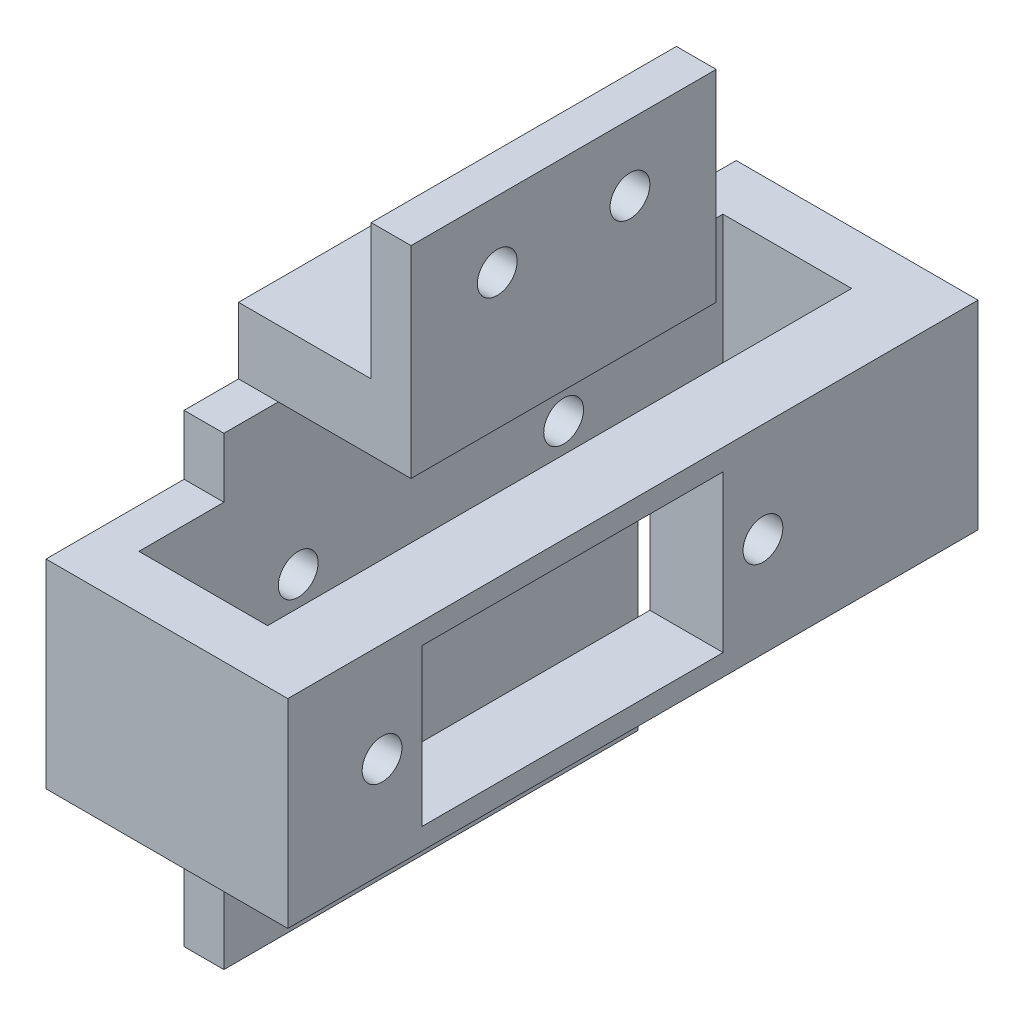
ISO-10303-21;
HEADER;
FILE_DESCRIPTION(('STEP AP214'),'2;1');
FILE_NAME('part.step','',(''),(''),'','','');
FILE_SCHEMA(('AUTOMOTIVE_DESIGN { 1 0 10303 214 1 1 1 1 }'));
ENDSEC;
DATA;
#1=APPLICATION_CONTEXT('core data for automotive mechanical design processes');
#2=APPLICATION_PROTOCOL_DEFINITION('international standard','automotive_design',2000,#1);
#3=PRODUCT_CONTEXT('',#1,'mechanical');
#4=PRODUCT('Part','Part','',(#3));
#5=PRODUCT_RELATED_PRODUCT_CATEGORY('part','',(#4));
#6=PRODUCT_DEFINITION_FORMATION('','',#4);
#7=PRODUCT_DEFINITION_CONTEXT('part definition',#1,'design');
#8=PRODUCT_DEFINITION('design','',#6,#7);
#9=PRODUCT_DEFINITION_SHAPE('','',#8);
#10=(LENGTH_UNIT() NAMED_UNIT(*) SI_UNIT(.MILLI.,.METRE.));
#11=(NAMED_UNIT(*) PLANE_ANGLE_UNIT() SI_UNIT($,.RADIAN.));
#12=(NAMED_UNIT(*) SI_UNIT($,.STERADIAN.) SOLID_ANGLE_UNIT());
#13=UNCERTAINTY_MEASURE_WITH_UNIT(LENGTH_MEASURE(1.E-05),#10,'distance_accuracy_value','');
#14=(GEOMETRIC_REPRESENTATION_CONTEXT(3) GLOBAL_UNCERTAINTY_ASSIGNED_CONTEXT((#13)) GLOBAL_UNIT_ASSIGNED_CONTEXT((#10,
#11,#12)) REPRESENTATION_CONTEXT('',''));
#15=CARTESIAN_POINT('',(0.,0.,0.));
#16=DIRECTION('',(0.,0.,1.));
#17=DIRECTION('',(1.,0.,0.));
#18=AXIS2_PLACEMENT_3D('',#15,#16,#17);
#19=CARTESIAN_POINT('',(2.69999999999999,0.,0.));
#20=DIRECTION('',(1.,0.,0.));
#21=DIRECTION('',(0.,0.,-1.));
#22=AXIS2_PLACEMENT_3D('',#19,#20,#21);
#23=PLANE('',#22);
#24=CARTESIAN_POINT('',(2.69999999999999,-27.2,7.4));
#25=DIRECTION('',(1.,0.,0.));
#26=DIRECTION('',(0.,0.,-1.));
#27=AXIS2_PLACEMENT_3D('',#24,#25,#26);
#28=CIRCLE('',#27,1.5);
#29=CARTESIAN_POINT('',(2.69999999999999,-27.2,5.9));
#30=VERTEX_POINT('',#29);
#31=EDGE_CURVE('E251',#30,#30,#28,.T.);
#32=ORIENTED_EDGE('',*,*,#31,.T.);
#33=EDGE_LOOP('',(#32));
#34=FACE_BOUND('',#33,.T.);
#35=DIRECTION('',(0.,0.,-1.));
#36=VECTOR('',#35,1.);
#37=CARTESIAN_POINT('',(2.69999999999999,-34.7,14.5058237934551));
#38=LINE('',#37,#36);
#39=CARTESIAN_POINT('',(2.69999999999999,-34.7,10.5058237934551));
#40=VERTEX_POINT('',#39);
#41=CARTESIAN_POINT('',(2.7,-34.7,-33.5058237934551));
#42=VERTEX_POINT('',#41);
#43=EDGE_CURVE('E303',#40,#42,#38,.T.);
#44=ORIENTED_EDGE('',*,*,#43,.F.);
#45=DIRECTION('',(0.,1.,0.));
#46=VECTOR('',#45,1.);
#47=CARTESIAN_POINT('',(2.69999999999999,-19.7,10.5058237934551));
#48=LINE('',#47,#46);
#49=CARTESIAN_POINT('',(2.69999999999999,-19.7,10.5058237934551));
#50=VERTEX_POINT('',#49);
#51=EDGE_CURVE('E317',#40,#50,#48,.T.);
#52=ORIENTED_EDGE('',*,*,#51,.T.);
#53=DIRECTION('',(0.,0.,1.));
#54=VECTOR('',#53,1.);
#55=CARTESIAN_POINT('',(2.69999999999999,-19.7,14.5058237934551));
#56=LINE('',#55,#54);
#57=CARTESIAN_POINT('',(2.7,-19.7,-33.5058237934551));
#58=VERTEX_POINT('',#57);
#59=EDGE_CURVE('E308',#58,#50,#56,.T.);
#60=ORIENTED_EDGE('',*,*,#59,.F.);
#61=DIRECTION('',(0.,1.,0.));
#62=VECTOR('',#61,1.);
#63=CARTESIAN_POINT('',(2.7,-19.7,-33.5058237934551));
#64=LINE('',#63,#62);
#65=EDGE_CURVE('E264',#42,#58,#64,.T.);
#66=ORIENTED_EDGE('',*,*,#65,.F.);
#67=EDGE_LOOP('',(#44,#52,#60,#66));
#68=FACE_BOUND('',#67,.T.);
#69=DIRECTION('',(0.,-1.,0.));
#70=VECTOR('',#69,1.);
#71=CARTESIAN_POINT('',(2.69999999999999,0.,-18.3));
#72=LINE('',#71,#70);
#73=CARTESIAN_POINT('',(2.69999999999999,-21.3,-18.3));
#74=VERTEX_POINT('',#73);
#75=CARTESIAN_POINT('',(2.69999999999999,-33.1,-18.3));
#76=VERTEX_POINT('',#75);
#77=EDGE_CURVE('E229',#74,#76,#72,.T.);
#78=ORIENTED_EDGE('',*,*,#77,.F.);
#79=DIRECTION('',(0.,0.,-1.));
#80=VECTOR('',#79,1.);
#81=CARTESIAN_POINT('',(2.69999999999999,-21.3,0.));
#82=LINE('',#81,#80);
#83=CARTESIAN_POINT('',(2.69999999999999,-21.3,4.4));
#84=VERTEX_POINT('',#83);
#85=EDGE_CURVE('E221',#84,#74,#82,.T.);
#86=ORIENTED_EDGE('',*,*,#85,.F.);
#87=DIRECTION('',(0.,-1.,0.));
#88=VECTOR('',#87,1.);
#89=CARTESIAN_POINT('',(2.69999999999999,0.,4.40000000000001));
#90=LINE('',#89,#88);
#91=CARTESIAN_POINT('',(2.69999999999999,-33.1,4.4));
#92=VERTEX_POINT('',#91);
#93=EDGE_CURVE('E57',#84,#92,#90,.T.);
#94=ORIENTED_EDGE('',*,*,#93,.T.);
#95=DIRECTION('',(0.,0.,-1.));
#96=VECTOR('',#95,1.);
#97=CARTESIAN_POINT('',(2.69999999999999,-33.1,0.));
#98=LINE('',#97,#96);
#99=EDGE_CURVE('E233',#92,#76,#98,.T.);
#100=ORIENTED_EDGE('',*,*,#99,.T.);
#101=EDGE_LOOP('',(#78,#86,#94,#100));
#102=FACE_BOUND('',#101,.T.);
#103=CARTESIAN_POINT('',(2.7,-27.2,-21.3));
#104=DIRECTION('',(1.,0.,0.));
#105=DIRECTION('',(0.,0.,-1.));
#106=AXIS2_PLACEMENT_3D('',#103,#104,#105);
#107=CIRCLE('',#106,1.5);
#108=CARTESIAN_POINT('',(2.7,-27.2,-22.8));
#109=VERTEX_POINT('',#108);
#110=EDGE_CURVE('E453',#109,#109,#107,.F.);
#111=ORIENTED_EDGE('',*,*,#110,.F.);
#112=EDGE_LOOP('',(#111));
#113=FACE_BOUND('',#112,.T.);
#114=ADVANCED_FACE('F38',(#34,#68,#102,#113),#23,.F.);
#115=CARTESIAN_POINT('',(8.21999999999999,0.,0.));
#116=DIRECTION('',(1.,0.,0.));
#117=DIRECTION('',(0.,0.,-1.));
#118=AXIS2_PLACEMENT_3D('',#115,#116,#117);
#119=PLANE('',#118);
#120=DIRECTION('',(0.,0.,-1.));
#121=VECTOR('',#120,1.);
#122=CARTESIAN_POINT('',(8.21999999999999,-21.3,0.));
#123=LINE('',#122,#121);
#124=CARTESIAN_POINT('',(8.21999999999999,-21.3,4.4));
#125=VERTEX_POINT('',#124);
#126=CARTESIAN_POINT('',(8.22,-21.3,-18.3));
#127=VERTEX_POINT('',#126);
#128=EDGE_CURVE('E250',#125,#127,#123,.T.);
#129=ORIENTED_EDGE('',*,*,#128,.T.);
#130=DIRECTION('',(0.,-1.,0.));
#131=VECTOR('',#130,1.);
#132=CARTESIAN_POINT('',(8.22,0.,-18.3));
#133=LINE('',#132,#131);
#134=CARTESIAN_POINT('',(8.22,-33.1,-18.3));
#135=VERTEX_POINT('',#134);
#136=EDGE_CURVE('E65',#127,#135,#133,.T.);
#137=ORIENTED_EDGE('',*,*,#136,.T.);
#138=DIRECTION('',(0.,0.,-1.));
#139=VECTOR('',#138,1.);
#140=CARTESIAN_POINT('',(8.21999999999999,-33.1,0.));
#141=LINE('',#140,#139);
#142=CARTESIAN_POINT('',(8.21999999999999,-33.1,4.4));
#143=VERTEX_POINT('',#142);
#144=EDGE_CURVE('E238',#143,#135,#141,.T.);
#145=ORIENTED_EDGE('',*,*,#144,.F.);
#146=DIRECTION('',(0.,-1.,0.));
#147=VECTOR('',#146,1.);
#148=CARTESIAN_POINT('',(8.21999999999999,0.,4.40000000000001));
#149=LINE('',#148,#147);
#150=EDGE_CURVE('E241',#125,#143,#149,.T.);
#151=ORIENTED_EDGE('',*,*,#150,.F.);
#152=EDGE_LOOP('',(#129,#137,#145,#151));
#153=FACE_BOUND('',#152,.T.);
#154=DIRECTION('',(0.,-1.,0.));
#155=VECTOR('',#154,1.);
#156=CARTESIAN_POINT('',(8.21999999999999,-19.7,14.5058237934551));
#157=LINE('',#156,#155);
#158=CARTESIAN_POINT('',(8.21999999999999,-19.7,14.5058237934551));
#159=VERTEX_POINT('',#158);
#160=CARTESIAN_POINT('',(8.21999999999999,-34.7,14.5058237934551));
#161=VERTEX_POINT('',#160);
#162=EDGE_CURVE('E304',#159,#161,#157,.T.);
#163=ORIENTED_EDGE('',*,*,#162,.T.);
#164=DIRECTION('',(0.,0.,-1.));
#165=VECTOR('',#164,1.);
#166=CARTESIAN_POINT('',(8.21999999999999,-34.7,14.5058237934551));
#167=LINE('',#166,#165);
#168=CARTESIAN_POINT('',(8.22,-34.7,-37.5058237934551));
#169=VERTEX_POINT('',#168);
#170=EDGE_CURVE('E307',#161,#169,#167,.T.);
#171=ORIENTED_EDGE('',*,*,#170,.T.);
#172=DIRECTION('',(0.,-1.,0.));
#173=VECTOR('',#172,1.);
#174=CARTESIAN_POINT('',(8.22,-19.7,-37.5058237934551));
#175=LINE('',#174,#173);
#176=CARTESIAN_POINT('',(8.22,-19.7,-37.5058237934551));
#177=VERTEX_POINT('',#176);
#178=EDGE_CURVE('E257',#177,#169,#175,.T.);
#179=ORIENTED_EDGE('',*,*,#178,.F.);
#180=DIRECTION('',(0.,0.,1.));
#181=VECTOR('',#180,1.);
#182=CARTESIAN_POINT('',(8.21999999999999,-19.7,14.5058237934551));
#183=LINE('',#182,#181);
#184=EDGE_CURVE('E310',#177,#159,#183,.T.);
#185=ORIENTED_EDGE('',*,*,#184,.T.);
#186=EDGE_LOOP('',(#163,#171,#179,#185));
#187=FACE_BOUND('',#186,.T.);
#188=CARTESIAN_POINT('',(8.21999999999999,-27.2,7.4));
#189=DIRECTION('',(1.,0.,0.));
#190=DIRECTION('',(0.,0.,-1.));
#191=AXIS2_PLACEMENT_3D('',#188,#189,#190);
#192=CIRCLE('',#191,1.5);
#193=CARTESIAN_POINT('',(8.21999999999999,-27.2,5.9));
#194=VERTEX_POINT('',#193);
#195=EDGE_CURVE('E457',#194,#194,#192,.T.);
#196=ORIENTED_EDGE('',*,*,#195,.F.);
#197=EDGE_LOOP('',(#196));
#198=FACE_BOUND('',#197,.T.);
#199=CARTESIAN_POINT('',(8.22,-27.2,-21.3));
#200=DIRECTION('',(1.,0.,0.));
#201=DIRECTION('',(0.,0.,-1.));
#202=AXIS2_PLACEMENT_3D('',#199,#200,#201);
#203=CIRCLE('',#202,1.5);
#204=CARTESIAN_POINT('',(8.22,-27.2,-22.8));
#205=VERTEX_POINT('',#204);
#206=EDGE_CURVE('E244',#205,#205,#203,.F.);
#207=ORIENTED_EDGE('',*,*,#206,.T.);
#208=EDGE_LOOP('',(#207));
#209=FACE_BOUND('',#208,.T.);
#210=ADVANCED_FACE('F557',(#153,#187,#198,#209),#119,.T.);
#211=CARTESIAN_POINT('',(-9.99999999999999,-50.2,-27.1));
#212=DIRECTION('',(0.,0.,1.));
#213=DIRECTION('',(0.,-1.,0.));
#214=AXIS2_PLACEMENT_3D('',#211,#212,#213);
#215=PLANE('',#214);
#216=DIRECTION('',(1.,0.,0.));
#217=VECTOR('',#216,1.);
#218=CARTESIAN_POINT('',(-10.,-19.7,-27.1));
#219=LINE('',#218,#217);
#220=CARTESIAN_POINT('',(-10.,-19.7,-27.1));
#221=VERTEX_POINT('',#220);
#222=CARTESIAN_POINT('',(-7.,-19.7,-27.1));
#223=VERTEX_POINT('',#222);
#224=EDGE_CURVE('E286',#221,#223,#219,.T.);
#225=ORIENTED_EDGE('',*,*,#224,.F.);
#226=DIRECTION('',(0.,1.,0.));
#227=VECTOR('',#226,1.);
#228=CARTESIAN_POINT('',(-9.99999999999999,-50.2,-27.1));
#229=LINE('',#228,#227);
#230=CARTESIAN_POINT('',(-9.99999999999999,-15.2,-27.1));
#231=VERTEX_POINT('',#230);
#232=EDGE_CURVE('E380',#221,#231,#229,.T.);
#233=ORIENTED_EDGE('',*,*,#232,.T.);
#234=DIRECTION('',(1.,0.,0.));
#235=VECTOR('',#234,1.);
#236=CARTESIAN_POINT('',(-9.99999999999999,-15.2,-27.1));
#237=LINE('',#236,#235);
#238=CARTESIAN_POINT('',(-7.,-15.2,-27.1));
#239=VERTEX_POINT('',#238);
#240=EDGE_CURVE('E363',#231,#239,#237,.T.);
#241=ORIENTED_EDGE('',*,*,#240,.T.);
#242=DIRECTION('',(0.,1.,0.));
#243=VECTOR('',#242,1.);
#244=CARTESIAN_POINT('',(-7.,-50.2,-27.1));
#245=LINE('',#244,#243);
#246=EDGE_CURVE('E376',#223,#239,#245,.T.);
#247=ORIENTED_EDGE('',*,*,#246,.F.);
#248=EDGE_LOOP('',(#225,#233,#241,#247));
#249=FACE_BOUND('',#248,.T.);
#250=ADVANCED_FACE('F484',(#249),#215,.F.);
#251=CARTESIAN_POINT('',(-7.00000000000001,-50.2,4.1));
#252=DIRECTION('',(-1.,0.,0.));
#253=DIRECTION('',(0.,0.,1.));
#254=AXIS2_PLACEMENT_3D('',#251,#252,#253);
#255=PLANE('',#254);
#256=CARTESIAN_POINT('',(-7.,-27.2,-21.5));
#257=DIRECTION('',(1.,0.,0.));
#258=DIRECTION('',(0.,0.,1.));
#259=AXIS2_PLACEMENT_3D('',#256,#257,#258);
#260=CIRCLE('',#259,1.5);
#261=CARTESIAN_POINT('',(-7.,-27.2,-20.));
#262=VERTEX_POINT('',#261);
#263=EDGE_CURVE('E468',#262,#262,#260,.T.);
#264=ORIENTED_EDGE('',*,*,#263,.F.);
#265=EDGE_LOOP('',(#264));
#266=FACE_BOUND('',#265,.T.);
#267=CARTESIAN_POINT('',(-7.,-45.2,-16.5));
#268=DIRECTION('',(1.,0.,0.));
#269=DIRECTION('',(0.,0.,1.));
#270=AXIS2_PLACEMENT_3D('',#267,#268,#269);
#271=CIRCLE('',#270,1.50000000000001);
#272=CARTESIAN_POINT('',(-7.,-45.2,-15.));
#273=VERTEX_POINT('',#272);
#274=EDGE_CURVE('E471',#273,#273,#271,.T.);
#275=ORIENTED_EDGE('',*,*,#274,.F.);
#276=EDGE_LOOP('',(#275));
#277=FACE_BOUND('',#276,.T.);
#278=CARTESIAN_POINT('',(-7.00000000000001,-27.2,-1.5));
#279=DIRECTION('',(1.,0.,0.));
#280=DIRECTION('',(0.,0.,-1.));
#281=AXIS2_PLACEMENT_3D('',#278,#279,#280);
#282=CIRCLE('',#281,1.5);
#283=CARTESIAN_POINT('',(-7.,-27.2,-3.00000000000001));
#284=VERTEX_POINT('',#283);
#285=EDGE_CURVE('E467',#284,#284,#282,.T.);
#286=ORIENTED_EDGE('',*,*,#285,.F.);
#287=EDGE_LOOP('',(#286));
#288=FACE_BOUND('',#287,.T.);
#289=CARTESIAN_POINT('',(-7.,-45.2,-6.5));
#290=DIRECTION('',(1.,0.,0.));
#291=DIRECTION('',(0.,0.,-1.));
#292=AXIS2_PLACEMENT_3D('',#289,#290,#291);
#293=CIRCLE('',#292,1.5);
#294=CARTESIAN_POINT('',(-7.,-45.2,-8.00000000000001));
#295=VERTEX_POINT('',#294);
#296=EDGE_CURVE('E443',#295,#295,#293,.T.);
#297=ORIENTED_EDGE('',*,*,#296,.F.);
#298=EDGE_LOOP('',(#297));
#299=FACE_BOUND('',#298,.T.);
#300=DIRECTION('',(0.,0.,1.));
#301=VECTOR('',#300,1.);
#302=CARTESIAN_POINT('',(-7.,-34.7,-27.1));
#303=LINE('',#302,#301);
#304=CARTESIAN_POINT('',(-7.,-34.7,-33.5058237934551));
#305=VERTEX_POINT('',#304);
#306=CARTESIAN_POINT('',(-7.,-34.7,-27.1));
#307=VERTEX_POINT('',#306);
#308=EDGE_CURVE('E274',#305,#307,#303,.T.);
#309=ORIENTED_EDGE('',*,*,#308,.F.);
#310=DIRECTION('',(0.,1.,0.));
#311=VECTOR('',#310,1.);
#312=CARTESIAN_POINT('',(-7.,-19.7,-33.5058237934551));
#313=LINE('',#312,#311);
#314=CARTESIAN_POINT('',(-7.,-19.7,-33.5058237934551));
#315=VERTEX_POINT('',#314);
#316=EDGE_CURVE('E263',#305,#315,#313,.T.);
#317=ORIENTED_EDGE('',*,*,#316,.T.);
#318=DIRECTION('',(0.,0.,-1.));
#319=VECTOR('',#318,1.);
#320=CARTESIAN_POINT('',(-7.,-19.7,-27.1));
#321=LINE('',#320,#319);
#322=EDGE_CURVE('E278',#223,#315,#321,.T.);
#323=ORIENTED_EDGE('',*,*,#322,.F.);
#324=ORIENTED_EDGE('',*,*,#246,.T.);
#325=DIRECTION('',(0.,0.,1.));
#326=VECTOR('',#325,1.);
#327=CARTESIAN_POINT('',(-7.00000000000001,-15.2,4.1));
#328=LINE('',#327,#326);
#329=CARTESIAN_POINT('',(-7.,-15.2,-23.));
#330=VERTEX_POINT('',#329);
#331=EDGE_CURVE('E49',#239,#330,#328,.T.);
#332=ORIENTED_EDGE('',*,*,#331,.T.);
#333=CARTESIAN_POINT('',(-7.00000000000001,-15.2,0.));
#334=VERTEX_POINT('',#333);
#335=EDGE_CURVE('E11',#330,#334,#328,.T.);
#336=ORIENTED_EDGE('',*,*,#335,.T.);
#337=CARTESIAN_POINT('',(-7.00000000000001,-15.2,4.1));
#338=VERTEX_POINT('',#337);
#339=EDGE_CURVE('E50',#334,#338,#328,.T.);
#340=ORIENTED_EDGE('',*,*,#339,.T.);
#341=DIRECTION('',(0.,1.,0.));
#342=VECTOR('',#341,1.);
#343=CARTESIAN_POINT('',(-7.00000000000001,-50.2,4.1));
#344=LINE('',#343,#342);
#345=CARTESIAN_POINT('',(-7.00000000000001,-19.7,4.1));
#346=VERTEX_POINT('',#345);
#347=EDGE_CURVE('E372',#346,#338,#344,.T.);
#348=ORIENTED_EDGE('',*,*,#347,.F.);
#349=DIRECTION('',(0.,0.,1.));
#350=VECTOR('',#349,1.);
#351=CARTESIAN_POINT('',(-7.00000000000001,-19.7,4.1));
#352=LINE('',#351,#350);
#353=CARTESIAN_POINT('',(-7.00000000000001,-19.7,10.5058237934551));
#354=VERTEX_POINT('',#353);
#355=EDGE_CURVE('E328',#346,#354,#352,.T.);
#356=ORIENTED_EDGE('',*,*,#355,.T.);
#357=DIRECTION('',(0.,1.,0.));
#358=VECTOR('',#357,1.);
#359=CARTESIAN_POINT('',(-7.00000000000001,-19.7,10.5058237934551));
#360=LINE('',#359,#358);
#361=CARTESIAN_POINT('',(-7.00000000000001,-34.7,10.5058237934551));
#362=VERTEX_POINT('',#361);
#363=EDGE_CURVE('E313',#362,#354,#360,.T.);
#364=ORIENTED_EDGE('',*,*,#363,.F.);
#365=DIRECTION('',(0.,0.,-1.));
#366=VECTOR('',#365,1.);
#367=CARTESIAN_POINT('',(-7.00000000000001,-34.7,4.09999999999999));
#368=LINE('',#367,#366);
#369=CARTESIAN_POINT('',(-7.00000000000001,-34.7,4.1));
#370=VERTEX_POINT('',#369);
#371=EDGE_CURVE('E333',#362,#370,#368,.T.);
#372=ORIENTED_EDGE('',*,*,#371,.T.);
#373=CARTESIAN_POINT('',(-7.,-50.2,4.10000000000001));
#374=VERTEX_POINT('',#373);
#375=EDGE_CURVE('E373',#374,#370,#344,.T.);
#376=ORIENTED_EDGE('',*,*,#375,.F.);
#377=DIRECTION('',(0.,0.,1.));
#378=VECTOR('',#377,1.);
#379=CARTESIAN_POINT('',(-7.00000000000001,-50.2,4.1));
#380=LINE('',#379,#378);
#381=CARTESIAN_POINT('',(-7.,-50.2,-27.1));
#382=VERTEX_POINT('',#381);
#383=EDGE_CURVE('E355',#382,#374,#380,.T.);
#384=ORIENTED_EDGE('',*,*,#383,.F.);
#385=EDGE_CURVE('E377',#382,#307,#245,.T.);
#386=ORIENTED_EDGE('',*,*,#385,.T.);
#387=EDGE_LOOP('',(#309,#317,#323,#324,#332,#336,#340,#348,#356,#364,#372,#376,#384,#386));
#388=FACE_BOUND('',#387,.T.);
#389=ADVANCED_FACE('F480',(#266,#277,#288,#299,#388),#255,.F.);
#390=CARTESIAN_POINT('',(-10.,-50.2,4.09999999999999));
#391=DIRECTION('',(0.,0.,-1.));
#392=DIRECTION('',(-1.,0.,0.));
#393=AXIS2_PLACEMENT_3D('',#390,#391,#392);
#394=PLANE('',#393);
#395=ORIENTED_EDGE('',*,*,#375,.T.);
#396=DIRECTION('',(1.,0.,0.));
#397=VECTOR('',#396,1.);
#398=CARTESIAN_POINT('',(-10.,-34.7,4.09999999999999));
#399=LINE('',#398,#397);
#400=CARTESIAN_POINT('',(-10.,-34.7,4.09999999999999));
#401=VERTEX_POINT('',#400);
#402=EDGE_CURVE('E342',#401,#370,#399,.T.);
#403=ORIENTED_EDGE('',*,*,#402,.F.);
#404=DIRECTION('',(0.,1.,0.));
#405=VECTOR('',#404,1.);
#406=CARTESIAN_POINT('',(-10.,-50.2,4.09999999999999));
#407=LINE('',#406,#405);
#408=CARTESIAN_POINT('',(-10.,-50.2,4.10000000000001));
#409=VERTEX_POINT('',#408);
#410=EDGE_CURVE('E369',#409,#401,#407,.T.);
#411=ORIENTED_EDGE('',*,*,#410,.F.);
#412=DIRECTION('',(1.,0.,0.));
#413=VECTOR('',#412,1.);
#414=CARTESIAN_POINT('',(-10.,-50.2,4.10000000000001));
#415=LINE('',#414,#413);
#416=EDGE_CURVE('E300',#409,#374,#415,.T.);
#417=ORIENTED_EDGE('',*,*,#416,.T.);
#418=EDGE_LOOP('',(#395,#403,#411,#417));
#419=FACE_BOUND('',#418,.T.);
#420=ADVANCED_FACE('F483',(#419),#394,.F.);
#421=CARTESIAN_POINT('',(3.,-15.2,0.));
#422=DIRECTION('',(0.,1.,0.));
#423=DIRECTION('',(0.,0.,1.));
#424=AXIS2_PLACEMENT_3D('',#421,#422,#423);
#425=PLANE('',#424);
#426=DIRECTION('',(-1.,0.,0.));
#427=VECTOR('',#426,1.);
#428=CARTESIAN_POINT('',(3.,-15.2,0.));
#429=LINE('',#428,#427);
#430=CARTESIAN_POINT('',(3.,-15.2,0.));
#431=VERTEX_POINT('',#430);
#432=EDGE_CURVE('E47',#431,#334,#429,.T.);
#433=ORIENTED_EDGE('',*,*,#432,.T.);
#434=ORIENTED_EDGE('',*,*,#335,.F.);
#435=DIRECTION('',(-1.,0.,0.));
#436=VECTOR('',#435,1.);
#437=CARTESIAN_POINT('',(3.,-15.2,-23.));
#438=LINE('',#437,#436);
#439=CARTESIAN_POINT('',(3.,-15.2,-23.));
#440=VERTEX_POINT('',#439);
#441=EDGE_CURVE('E435',#440,#330,#438,.T.);
#442=ORIENTED_EDGE('',*,*,#441,.F.);
#443=DIRECTION('',(0.,0.,-1.));
#444=VECTOR('',#443,1.);
#445=CARTESIAN_POINT('',(3.,-15.2,0.));
#446=LINE('',#445,#444);
#447=EDGE_CURVE('E416',#431,#440,#446,.T.);
#448=ORIENTED_EDGE('',*,*,#447,.F.);
#449=EDGE_LOOP('',(#433,#434,#442,#448));
#450=FACE_BOUND('',#449,.T.);
#451=ADVANCED_FACE('F626',(#450),#425,.F.);
#452=CARTESIAN_POINT('',(0.,0.,0.));
#453=DIRECTION('',(1.,0.,0.));
#454=DIRECTION('',(0.,0.,-1.));
#455=AXIS2_PLACEMENT_3D('',#452,#453,#454);
#456=PLANE('',#455);
#457=CARTESIAN_POINT('',(0.,-5.,-16.5));
#458=DIRECTION('',(1.,0.,0.));
#459=DIRECTION('',(0.,0.,1.));
#460=AXIS2_PLACEMENT_3D('',#457,#458,#459);
#461=CIRCLE('',#460,1.5);
#462=CARTESIAN_POINT('',(0.,-5.,-15.));
#463=VERTEX_POINT('',#462);
#464=EDGE_CURVE('E400',#463,#463,#461,.T.);
#465=ORIENTED_EDGE('',*,*,#464,.T.);
#466=EDGE_LOOP('',(#465));
#467=FACE_BOUND('',#466,.T.);
#468=CARTESIAN_POINT('',(0.,-5.,-6.5));
#469=DIRECTION('',(1.,0.,0.));
#470=DIRECTION('',(0.,0.,-1.));
#471=AXIS2_PLACEMENT_3D('',#468,#469,#470);
#472=CIRCLE('',#471,1.5);
#473=CARTESIAN_POINT('',(0.,-5.,-8.));
#474=VERTEX_POINT('',#473);
#475=EDGE_CURVE('E404',#474,#474,#472,.T.);
#476=ORIENTED_EDGE('',*,*,#475,.T.);
#477=EDGE_LOOP('',(#476));
#478=FACE_BOUND('',#477,.T.);
#479=DIRECTION('',(0.,0.,-1.));
#480=VECTOR('',#479,1.);
#481=CARTESIAN_POINT('',(0.,-10.2,-23.));
#482=LINE('',#481,#480);
#483=CARTESIAN_POINT('',(0.,-10.2,0.));
#484=VERTEX_POINT('',#483);
#485=CARTESIAN_POINT('',(0.,-10.2,-23.));
#486=VERTEX_POINT('',#485);
#487=EDGE_CURVE('E384',#484,#486,#482,.T.);
#488=ORIENTED_EDGE('',*,*,#487,.F.);
#489=DIRECTION('',(0.,-1.,0.));
#490=VECTOR('',#489,1.);
#491=CARTESIAN_POINT('',(0.,0.,0.));
#492=LINE('',#491,#490);
#493=CARTESIAN_POINT('',(0.,0.,0.));
#494=VERTEX_POINT('',#493);
#495=EDGE_CURVE('E410',#494,#484,#492,.T.);
#496=ORIENTED_EDGE('',*,*,#495,.F.);
#497=DIRECTION('',(0.,0.,1.));
#498=VECTOR('',#497,1.);
#499=CARTESIAN_POINT('',(0.,0.,0.));
#500=LINE('',#499,#498);
#501=CARTESIAN_POINT('',(0.,0.,-23.));
#502=VERTEX_POINT('',#501);
#503=EDGE_CURVE('E417',#502,#494,#500,.T.);
#504=ORIENTED_EDGE('',*,*,#503,.F.);
#505=DIRECTION('',(0.,1.,0.));
#506=VECTOR('',#505,1.);
#507=CARTESIAN_POINT('',(0.,0.,-23.));
#508=LINE('',#507,#506);
#509=EDGE_CURVE('E426',#486,#502,#508,.T.);
#510=ORIENTED_EDGE('',*,*,#509,.F.);
#511=EDGE_LOOP('',(#488,#496,#504,#510));
#512=FACE_BOUND('',#511,.T.);
#513=ADVANCED_FACE('F622',(#467,#478,#512),#456,.F.);
#514=CARTESIAN_POINT('',(3.,0.,0.));
#515=DIRECTION('',(1.,0.,0.));
#516=DIRECTION('',(0.,0.,-1.));
#517=AXIS2_PLACEMENT_3D('',#514,#515,#516);
#518=PLANE('',#517);
#519=CARTESIAN_POINT('',(3.,-5.,-6.5));
#520=DIRECTION('',(1.,0.,0.));
#521=DIRECTION('',(0.,0.,-1.));
#522=AXIS2_PLACEMENT_3D('',#519,#520,#521);
#523=CIRCLE('',#522,1.5);
#524=CARTESIAN_POINT('',(3.,-5.,-8.));
#525=VERTEX_POINT('',#524);
#526=EDGE_CURVE('E407',#525,#525,#523,.T.);
#527=ORIENTED_EDGE('',*,*,#526,.F.);
#528=EDGE_LOOP('',(#527));
#529=FACE_BOUND('',#528,.T.);
#530=DIRECTION('',(0.,-1.,0.));
#531=VECTOR('',#530,1.);
#532=CARTESIAN_POINT('',(3.,0.,0.));
#533=LINE('',#532,#531);
#534=CARTESIAN_POINT('',(3.,0.,0.));
#535=VERTEX_POINT('',#534);
#536=EDGE_CURVE('E413',#535,#431,#533,.T.);
#537=ORIENTED_EDGE('',*,*,#536,.T.);
#538=ORIENTED_EDGE('',*,*,#447,.T.);
#539=DIRECTION('',(0.,1.,0.));
#540=VECTOR('',#539,1.);
#541=CARTESIAN_POINT('',(3.,0.,-23.));
#542=LINE('',#541,#540);
#543=CARTESIAN_POINT('',(3.,0.,-23.));
#544=VERTEX_POINT('',#543);
#545=EDGE_CURVE('E419',#440,#544,#542,.T.);
#546=ORIENTED_EDGE('',*,*,#545,.T.);
#547=DIRECTION('',(0.,0.,1.));
#548=VECTOR('',#547,1.);
#549=CARTESIAN_POINT('',(3.,0.,0.));
#550=LINE('',#549,#548);
#551=EDGE_CURVE('E421',#544,#535,#550,.T.);
#552=ORIENTED_EDGE('',*,*,#551,.T.);
#553=EDGE_LOOP('',(#537,#538,#546,#552));
#554=FACE_BOUND('',#553,.T.);
#555=CARTESIAN_POINT('',(3.,-5.,-16.5));
#556=DIRECTION('',(1.,0.,0.));
#557=DIRECTION('',(0.,0.,1.));
#558=AXIS2_PLACEMENT_3D('',#555,#556,#557);
#559=CIRCLE('',#558,1.5);
#560=CARTESIAN_POINT('',(3.,-5.,-15.));
#561=VERTEX_POINT('',#560);
#562=EDGE_CURVE('E401',#561,#561,#559,.T.);
#563=ORIENTED_EDGE('',*,*,#562,.F.);
#564=EDGE_LOOP('',(#563));
#565=FACE_BOUND('',#564,.T.);
#566=ADVANCED_FACE('F619',(#529,#554,#565),#518,.T.);
#567=CARTESIAN_POINT('',(3.,0.,0.));
#568=DIRECTION('',(0.,0.,-1.));
#569=DIRECTION('',(0.,1.,0.));
#570=AXIS2_PLACEMENT_3D('',#567,#568,#569);
#571=PLANE('',#570);
#572=ORIENTED_EDGE('',*,*,#495,.T.);
#573=DIRECTION('',(1.,0.,0.));
#574=VECTOR('',#573,1.);
#575=CARTESIAN_POINT('',(-10.,-10.2,0.));
#576=LINE('',#575,#574);
#577=CARTESIAN_POINT('',(-10.,-10.2,0.));
#578=VERTEX_POINT('',#577);
#579=EDGE_CURVE('E397',#578,#484,#576,.T.);
#580=ORIENTED_EDGE('',*,*,#579,.F.);
#581=DIRECTION('',(0.,1.,0.));
#582=VECTOR('',#581,1.);
#583=CARTESIAN_POINT('',(-10.,-10.2,0.));
#584=LINE('',#583,#582);
#585=CARTESIAN_POINT('',(-10.,-15.2,0.));
#586=VERTEX_POINT('',#585);
#587=EDGE_CURVE('E388',#586,#578,#584,.T.);
#588=ORIENTED_EDGE('',*,*,#587,.F.);
#589=EDGE_CURVE('E437',#334,#586,#429,.T.);
#590=ORIENTED_EDGE('',*,*,#589,.F.);
#591=ORIENTED_EDGE('',*,*,#432,.F.);
#592=ORIENTED_EDGE('',*,*,#536,.F.);
#593=DIRECTION('',(-1.,0.,0.));
#594=VECTOR('',#593,1.);
#595=CARTESIAN_POINT('',(3.,0.,0.));
#596=LINE('',#595,#594);
#597=EDGE_CURVE('E423',#535,#494,#596,.T.);
#598=ORIENTED_EDGE('',*,*,#597,.T.);
#599=EDGE_LOOP('',(#572,#580,#588,#590,#591,#592,#598));
#600=FACE_BOUND('',#599,.T.);
#601=ADVANCED_FACE('F40',(#600),#571,.F.);
#602=CARTESIAN_POINT('',(3.,0.,-23.));
#603=DIRECTION('',(0.,0.,1.));
#604=DIRECTION('',(0.,-1.,0.));
#605=AXIS2_PLACEMENT_3D('',#602,#603,#604);
#606=PLANE('',#605);
#607=ORIENTED_EDGE('',*,*,#441,.T.);
#608=CARTESIAN_POINT('',(-10.,-15.2,-23.));
#609=VERTEX_POINT('',#608);
#610=EDGE_CURVE('E434',#330,#609,#438,.T.);
#611=ORIENTED_EDGE('',*,*,#610,.T.);
#612=DIRECTION('',(0.,-1.,0.));
#613=VECTOR('',#612,1.);
#614=CARTESIAN_POINT('',(-10.,-15.2,-23.));
#615=LINE('',#614,#613);
#616=CARTESIAN_POINT('',(-10.,-10.2,-23.));
#617=VERTEX_POINT('',#616);
#618=EDGE_CURVE('E385',#617,#609,#615,.T.);
#619=ORIENTED_EDGE('',*,*,#618,.F.);
#620=DIRECTION('',(1.,0.,0.));
#621=VECTOR('',#620,1.);
#622=CARTESIAN_POINT('',(-10.,-10.2,-23.));
#623=LINE('',#622,#621);
#624=EDGE_CURVE('E392',#617,#486,#623,.T.);
#625=ORIENTED_EDGE('',*,*,#624,.T.);
#626=ORIENTED_EDGE('',*,*,#509,.T.);
#627=DIRECTION('',(-1.,0.,0.));
#628=VECTOR('',#627,1.);
#629=CARTESIAN_POINT('',(3.,0.,-23.));
#630=LINE('',#629,#628);
#631=EDGE_CURVE('E431',#544,#502,#630,.T.);
#632=ORIENTED_EDGE('',*,*,#631,.F.);
#633=ORIENTED_EDGE('',*,*,#545,.F.);
#634=EDGE_LOOP('',(#607,#611,#619,#625,#626,#632,#633));
#635=FACE_BOUND('',#634,.T.);
#636=ADVANCED_FACE('F630',(#635),#606,.F.);
#637=CARTESIAN_POINT('',(3.,0.,0.));
#638=DIRECTION('',(0.,-1.,0.));
#639=DIRECTION('',(0.,0.,-1.));
#640=AXIS2_PLACEMENT_3D('',#637,#638,#639);
#641=PLANE('',#640);
#642=ORIENTED_EDGE('',*,*,#503,.T.);
#643=ORIENTED_EDGE('',*,*,#597,.F.);
#644=ORIENTED_EDGE('',*,*,#551,.F.);
#645=ORIENTED_EDGE('',*,*,#631,.T.);
#646=EDGE_LOOP('',(#642,#643,#644,#645));
#647=FACE_BOUND('',#646,.T.);
#648=ADVANCED_FACE('F617',(#647),#641,.F.);
#649=CARTESIAN_POINT('',(3.,-5.,-6.5));
#650=DIRECTION('',(-1.,0.,0.));
#651=DIRECTION('',(0.,0.,1.));
#652=AXIS2_PLACEMENT_3D('',#649,#650,#651);
#653=CYLINDRICAL_SURFACE('',#652,1.5);
#654=ORIENTED_EDGE('',*,*,#526,.T.);
#655=EDGE_LOOP('',(#654));
#656=FACE_BOUND('',#655,.T.);
#657=ORIENTED_EDGE('',*,*,#475,.F.);
#658=EDGE_LOOP('',(#657));
#659=FACE_BOUND('',#658,.T.);
#660=ADVANCED_FACE('F613',(#656,#659),#653,.F.);
#661=CARTESIAN_POINT('',(3.,-5.,-16.5));
#662=DIRECTION('',(-1.,0.,0.));
#663=DIRECTION('',(0.,0.,1.));
#664=AXIS2_PLACEMENT_3D('',#661,#662,#663);
#665=CYLINDRICAL_SURFACE('',#664,1.5);
#666=ORIENTED_EDGE('',*,*,#562,.T.);
#667=EDGE_LOOP('',(#666));
#668=FACE_BOUND('',#667,.T.);
#669=ORIENTED_EDGE('',*,*,#464,.F.);
#670=EDGE_LOOP('',(#669));
#671=FACE_BOUND('',#670,.T.);
#672=ADVANCED_FACE('F610',(#668,#671),#665,.F.);
#673=CARTESIAN_POINT('',(-10.,-10.2,-23.));
#674=DIRECTION('',(0.,-1.,0.));
#675=DIRECTION('',(0.,0.,-1.));
#676=AXIS2_PLACEMENT_3D('',#673,#674,#675);
#677=PLANE('',#676);
#678=ORIENTED_EDGE('',*,*,#487,.T.);
#679=ORIENTED_EDGE('',*,*,#624,.F.);
#680=DIRECTION('',(0.,0.,-1.));
#681=VECTOR('',#680,1.);
#682=CARTESIAN_POINT('',(-10.,-10.2,-23.));
#683=LINE('',#682,#681);
#684=EDGE_CURVE('E390',#578,#617,#683,.T.);
#685=ORIENTED_EDGE('',*,*,#684,.F.);
#686=ORIENTED_EDGE('',*,*,#579,.T.);
#687=EDGE_LOOP('',(#678,#679,#685,#686));
#688=FACE_BOUND('',#687,.T.);
#689=ADVANCED_FACE('F536',(#688),#677,.F.);
#690=CARTESIAN_POINT('',(-10.,0.,0.));
#691=DIRECTION('',(1.,0.,0.));
#692=DIRECTION('',(0.,0.,-1.));
#693=AXIS2_PLACEMENT_3D('',#690,#691,#692);
#694=PLANE('',#693);
#695=CARTESIAN_POINT('',(-10.,-27.2,-21.5));
#696=DIRECTION('',(1.,0.,0.));
#697=DIRECTION('',(0.,0.,-1.));
#698=AXIS2_PLACEMENT_3D('',#695,#696,#697);
#699=CIRCLE('',#698,1.5);
#700=CARTESIAN_POINT('',(-10.,-27.2,-23.));
#701=VERTEX_POINT('',#700);
#702=EDGE_CURVE('E42',#701,#701,#699,.T.);
#703=ORIENTED_EDGE('',*,*,#702,.T.);
#704=EDGE_LOOP('',(#703));
#705=FACE_BOUND('',#704,.T.);
#706=CARTESIAN_POINT('',(-10.,-45.2,-16.5));
#707=DIRECTION('',(1.,0.,0.));
#708=DIRECTION('',(0.,0.,-1.));
#709=AXIS2_PLACEMENT_3D('',#706,#707,#708);
#710=CIRCLE('',#709,1.50000000000001);
#711=CARTESIAN_POINT('',(-10.,-45.2,-18.));
#712=VERTEX_POINT('',#711);
#713=EDGE_CURVE('E445',#712,#712,#710,.T.);
#714=ORIENTED_EDGE('',*,*,#713,.T.);
#715=EDGE_LOOP('',(#714));
#716=FACE_BOUND('',#715,.T.);
#717=CARTESIAN_POINT('',(-10.,-27.2,-1.5));
#718=DIRECTION('',(1.,0.,0.));
#719=DIRECTION('',(0.,0.,-1.));
#720=AXIS2_PLACEMENT_3D('',#717,#718,#719);
#721=CIRCLE('',#720,1.5);
#722=CARTESIAN_POINT('',(-10.,-27.2,-3.00000000000001));
#723=VERTEX_POINT('',#722);
#724=EDGE_CURVE('E442',#723,#723,#721,.T.);
#725=ORIENTED_EDGE('',*,*,#724,.T.);
#726=EDGE_LOOP('',(#725));
#727=FACE_BOUND('',#726,.T.);
#728=CARTESIAN_POINT('',(-10.,-45.2,-6.50000000000001));
#729=DIRECTION('',(1.,0.,0.));
#730=DIRECTION('',(0.,0.,-1.));
#731=AXIS2_PLACEMENT_3D('',#728,#729,#730);
#732=CIRCLE('',#731,1.5);
#733=CARTESIAN_POINT('',(-10.,-45.2,-8.00000000000001));
#734=VERTEX_POINT('',#733);
#735=EDGE_CURVE('E439',#734,#734,#732,.T.);
#736=ORIENTED_EDGE('',*,*,#735,.T.);
#737=EDGE_LOOP('',(#736));
#738=FACE_BOUND('',#737,.T.);
#739=DIRECTION('',(0.,0.,1.));
#740=VECTOR('',#739,1.);
#741=CARTESIAN_POINT('',(-10.,-19.7,4.1));
#742=LINE('',#741,#740);
#743=CARTESIAN_POINT('',(-10.,-19.7,4.1));
#744=VERTEX_POINT('',#743);
#745=CARTESIAN_POINT('',(-10.,-19.7,14.5058237934551));
#746=VERTEX_POINT('',#745);
#747=EDGE_CURVE('E329',#744,#746,#742,.T.);
#748=ORIENTED_EDGE('',*,*,#747,.F.);
#749=CARTESIAN_POINT('',(-10.,-15.2,4.1));
#750=VERTEX_POINT('',#749);
#751=EDGE_CURVE('E359',#744,#750,#407,.T.);
#752=ORIENTED_EDGE('',*,*,#751,.T.);
#753=DIRECTION('',(0.,0.,-1.));
#754=VECTOR('',#753,1.);
#755=CARTESIAN_POINT('',(-10.,-15.2,4.1));
#756=LINE('',#755,#754);
#757=EDGE_CURVE('E360',#750,#586,#756,.T.);
#758=ORIENTED_EDGE('',*,*,#757,.T.);
#759=ORIENTED_EDGE('',*,*,#587,.T.);
#760=ORIENTED_EDGE('',*,*,#684,.T.);
#761=ORIENTED_EDGE('',*,*,#618,.T.);
#762=EDGE_CURVE('E345',#609,#231,#756,.T.);
#763=ORIENTED_EDGE('',*,*,#762,.T.);
#764=ORIENTED_EDGE('',*,*,#232,.F.);
#765=DIRECTION('',(0.,0.,-1.));
#766=VECTOR('',#765,1.);
#767=CARTESIAN_POINT('',(-10.,-19.7,-27.1));
#768=LINE('',#767,#766);
#769=CARTESIAN_POINT('',(-10.,-19.7,-37.5058237934551));
#770=VERTEX_POINT('',#769);
#771=EDGE_CURVE('E280',#221,#770,#768,.T.);
#772=ORIENTED_EDGE('',*,*,#771,.T.);
#773=DIRECTION('',(0.,-1.,0.));
#774=VECTOR('',#773,1.);
#775=CARTESIAN_POINT('',(-10.,-19.7,-37.5058237934551));
#776=LINE('',#775,#774);
#777=CARTESIAN_POINT('',(-10.,-34.7,-37.5058237934551));
#778=VERTEX_POINT('',#777);
#779=EDGE_CURVE('E277',#770,#778,#776,.T.);
#780=ORIENTED_EDGE('',*,*,#779,.T.);
#781=DIRECTION('',(0.,0.,1.));
#782=VECTOR('',#781,1.);
#783=CARTESIAN_POINT('',(-10.,-34.7,-27.1));
#784=LINE('',#783,#782);
#785=CARTESIAN_POINT('',(-10.,-34.7,-27.1));
#786=VERTEX_POINT('',#785);
#787=EDGE_CURVE('E275',#778,#786,#784,.T.);
#788=ORIENTED_EDGE('',*,*,#787,.T.);
#789=CARTESIAN_POINT('',(-10.,-50.2,-27.1));
#790=VERTEX_POINT('',#789);
#791=EDGE_CURVE('E381',#790,#786,#229,.T.);
#792=ORIENTED_EDGE('',*,*,#791,.F.);
#793=DIRECTION('',(0.,0.,-1.));
#794=VECTOR('',#793,1.);
#795=CARTESIAN_POINT('',(-10.,-50.2,4.09999999999999));
#796=LINE('',#795,#794);
#797=EDGE_CURVE('E352',#409,#790,#796,.T.);
#798=ORIENTED_EDGE('',*,*,#797,.F.);
#799=ORIENTED_EDGE('',*,*,#410,.T.);
#800=DIRECTION('',(0.,0.,-1.));
#801=VECTOR('',#800,1.);
#802=CARTESIAN_POINT('',(-10.,-34.7,4.09999999999999));
#803=LINE('',#802,#801);
#804=CARTESIAN_POINT('',(-10.,-34.7,14.5058237934551));
#805=VERTEX_POINT('',#804);
#806=EDGE_CURVE('E336',#805,#401,#803,.T.);
#807=ORIENTED_EDGE('',*,*,#806,.F.);
#808=DIRECTION('',(0.,-1.,0.));
#809=VECTOR('',#808,1.);
#810=CARTESIAN_POINT('',(-10.,-19.7,14.5058237934551));
#811=LINE('',#810,#809);
#812=EDGE_CURVE('E332',#746,#805,#811,.T.);
#813=ORIENTED_EDGE('',*,*,#812,.F.);
#814=EDGE_LOOP('',(#748,#752,#758,#759,#760,#761,#763,#764,#772,#780,#788,#792,#798,#799,#807,#813));
#815=FACE_BOUND('',#814,.T.);
#816=ADVANCED_FACE('F503',(#705,#716,#727,#738,#815),#694,.F.);
#817=CARTESIAN_POINT('',(0.,-15.2,0.));
#818=DIRECTION('',(0.,-1.,0.));
#819=DIRECTION('',(0.,0.,-1.));
#820=AXIS2_PLACEMENT_3D('',#817,#818,#819);
#821=PLANE('',#820);
#822=ORIENTED_EDGE('',*,*,#339,.F.);
#823=ORIENTED_EDGE('',*,*,#589,.T.);
#824=ORIENTED_EDGE('',*,*,#757,.F.);
#825=DIRECTION('',(-1.,0.,0.));
#826=VECTOR('',#825,1.);
#827=CARTESIAN_POINT('',(-10.,-15.2,4.1));
#828=LINE('',#827,#826);
#829=EDGE_CURVE('E356',#338,#750,#828,.T.);
#830=ORIENTED_EDGE('',*,*,#829,.F.);
#831=EDGE_LOOP('',(#822,#823,#824,#830));
#832=FACE_BOUND('',#831,.T.);
#833=ADVANCED_FACE('F527',(#832),#821,.F.);
#834=ORIENTED_EDGE('',*,*,#791,.T.);
#835=DIRECTION('',(1.,0.,0.));
#836=VECTOR('',#835,1.);
#837=CARTESIAN_POINT('',(-10.,-34.7,-27.1));
#838=LINE('',#837,#836);
#839=EDGE_CURVE('E282',#786,#307,#838,.T.);
#840=ORIENTED_EDGE('',*,*,#839,.T.);
#841=ORIENTED_EDGE('',*,*,#385,.F.);
#842=DIRECTION('',(-1.,0.,0.));
#843=VECTOR('',#842,1.);
#844=CARTESIAN_POINT('',(-10.,-50.2,-27.1));
#845=LINE('',#844,#843);
#846=EDGE_CURVE('E289',#382,#790,#845,.T.);
#847=ORIENTED_EDGE('',*,*,#846,.T.);
#848=EDGE_LOOP('',(#834,#840,#841,#847));
#849=FACE_BOUND('',#848,.T.);
#850=ADVANCED_FACE('F498',(#849),#215,.F.);
#851=ORIENTED_EDGE('',*,*,#751,.F.);
#852=DIRECTION('',(1.,0.,0.));
#853=VECTOR('',#852,1.);
#854=CARTESIAN_POINT('',(-10.,-19.7,4.1));
#855=LINE('',#854,#853);
#856=EDGE_CURVE('E339',#744,#346,#855,.T.);
#857=ORIENTED_EDGE('',*,*,#856,.T.);
#858=ORIENTED_EDGE('',*,*,#347,.T.);
#859=ORIENTED_EDGE('',*,*,#829,.T.);
#860=EDGE_LOOP('',(#851,#857,#858,#859));
#861=FACE_BOUND('',#860,.T.);
#862=ADVANCED_FACE('F519',(#861),#394,.F.);
#863=CARTESIAN_POINT('',(0.,-50.2,0.));
#864=DIRECTION('',(0.,-1.,0.));
#865=DIRECTION('',(0.,0.,-1.));
#866=AXIS2_PLACEMENT_3D('',#863,#864,#865);
#867=PLANE('',#866);
#868=ORIENTED_EDGE('',*,*,#383,.T.);
#869=ORIENTED_EDGE('',*,*,#416,.F.);
#870=ORIENTED_EDGE('',*,*,#797,.T.);
#871=ORIENTED_EDGE('',*,*,#846,.F.);
#872=EDGE_LOOP('',(#868,#869,#870,#871));
#873=FACE_BOUND('',#872,.T.);
#874=ADVANCED_FACE('F506',(#873),#867,.T.);
#875=ORIENTED_EDGE('',*,*,#610,.F.);
#876=ORIENTED_EDGE('',*,*,#331,.F.);
#877=ORIENTED_EDGE('',*,*,#240,.F.);
#878=ORIENTED_EDGE('',*,*,#762,.F.);
#879=EDGE_LOOP('',(#875,#876,#877,#878));
#880=FACE_BOUND('',#879,.T.);
#881=ADVANCED_FACE('F545',(#880),#821,.F.);
#882=CARTESIAN_POINT('',(-10.,-34.7,4.09999999999999));
#883=DIRECTION('',(0.,-1.,0.));
#884=DIRECTION('',(0.,0.,-1.));
#885=AXIS2_PLACEMENT_3D('',#882,#883,#884);
#886=PLANE('',#885);
#887=ORIENTED_EDGE('',*,*,#371,.F.);
#888=DIRECTION('',(-1.,0.,0.));
#889=VECTOR('',#888,1.);
#890=CARTESIAN_POINT('',(2.69999999999999,-34.7,10.5058237934551));
#891=LINE('',#890,#889);
#892=EDGE_CURVE('E325',#40,#362,#891,.T.);
#893=ORIENTED_EDGE('',*,*,#892,.F.);
#894=ORIENTED_EDGE('',*,*,#43,.T.);
#895=DIRECTION('',(-1.,0.,0.));
#896=VECTOR('',#895,1.);
#897=CARTESIAN_POINT('',(2.7,-34.7,-33.5058237934551));
#898=LINE('',#897,#896);
#899=EDGE_CURVE('E267',#42,#305,#898,.T.);
#900=ORIENTED_EDGE('',*,*,#899,.T.);
#901=ORIENTED_EDGE('',*,*,#308,.T.);
#902=ORIENTED_EDGE('',*,*,#839,.F.);
#903=ORIENTED_EDGE('',*,*,#787,.F.);
#904=DIRECTION('',(1.,0.,0.));
#905=VECTOR('',#904,1.);
#906=CARTESIAN_POINT('',(-10.,-34.7,-37.5058237934551));
#907=LINE('',#906,#905);
#908=EDGE_CURVE('E293',#778,#169,#907,.T.);
#909=ORIENTED_EDGE('',*,*,#908,.T.);
#910=ORIENTED_EDGE('',*,*,#170,.F.);
#911=DIRECTION('',(1.,0.,0.));
#912=VECTOR('',#911,1.);
#913=CARTESIAN_POINT('',(-10.,-34.7,14.5058237934551));
#914=LINE('',#913,#912);
#915=EDGE_CURVE('E346',#805,#161,#914,.T.);
#916=ORIENTED_EDGE('',*,*,#915,.F.);
#917=ORIENTED_EDGE('',*,*,#806,.T.);
#918=ORIENTED_EDGE('',*,*,#402,.T.);
#919=EDGE_LOOP('',(#887,#893,#894,#900,#901,#902,#903,#909,#910,#916,#917,#918));
#920=FACE_BOUND('',#919,.T.);
#921=ADVANCED_FACE('F494',(#920),#886,.T.);
#922=CARTESIAN_POINT('',(-10.,-19.7,14.5058237934551));
#923=DIRECTION('',(0.,0.,1.));
#924=DIRECTION('',(1.,0.,0.));
#925=AXIS2_PLACEMENT_3D('',#922,#923,#924);
#926=PLANE('',#925);
#927=ORIENTED_EDGE('',*,*,#915,.T.);
#928=ORIENTED_EDGE('',*,*,#162,.F.);
#929=DIRECTION('',(1.,0.,0.));
#930=VECTOR('',#929,1.);
#931=CARTESIAN_POINT('',(-10.,-19.7,14.5058237934551));
#932=LINE('',#931,#930);
#933=EDGE_CURVE('E348',#746,#159,#932,.T.);
#934=ORIENTED_EDGE('',*,*,#933,.F.);
#935=ORIENTED_EDGE('',*,*,#812,.T.);
#936=EDGE_LOOP('',(#927,#928,#934,#935));
#937=FACE_BOUND('',#936,.T.);
#938=ADVANCED_FACE('F513',(#937),#926,.T.);
#939=CARTESIAN_POINT('',(-10.,-19.7,4.1));
#940=DIRECTION('',(0.,1.,0.));
#941=DIRECTION('',(0.,0.,1.));
#942=AXIS2_PLACEMENT_3D('',#939,#940,#941);
#943=PLANE('',#942);
#944=ORIENTED_EDGE('',*,*,#355,.F.);
#945=ORIENTED_EDGE('',*,*,#856,.F.);
#946=ORIENTED_EDGE('',*,*,#747,.T.);
#947=ORIENTED_EDGE('',*,*,#933,.T.);
#948=ORIENTED_EDGE('',*,*,#184,.F.);
#949=DIRECTION('',(1.,0.,0.));
#950=VECTOR('',#949,1.);
#951=CARTESIAN_POINT('',(-10.,-19.7,-37.5058237934551));
#952=LINE('',#951,#950);
#953=EDGE_CURVE('E290',#770,#177,#952,.T.);
#954=ORIENTED_EDGE('',*,*,#953,.F.);
#955=ORIENTED_EDGE('',*,*,#771,.F.);
#956=ORIENTED_EDGE('',*,*,#224,.T.);
#957=ORIENTED_EDGE('',*,*,#322,.T.);
#958=DIRECTION('',(-1.,0.,0.));
#959=VECTOR('',#958,1.);
#960=CARTESIAN_POINT('',(2.7,-19.7,-33.5058237934551));
#961=LINE('',#960,#959);
#962=EDGE_CURVE('E272',#58,#315,#961,.T.);
#963=ORIENTED_EDGE('',*,*,#962,.F.);
#964=ORIENTED_EDGE('',*,*,#59,.T.);
#965=DIRECTION('',(-1.,0.,0.));
#966=VECTOR('',#965,1.);
#967=CARTESIAN_POINT('',(2.69999999999999,-19.7,10.5058237934551));
#968=LINE('',#967,#966);
#969=EDGE_CURVE('E320',#50,#354,#968,.T.);
#970=ORIENTED_EDGE('',*,*,#969,.T.);
#971=EDGE_LOOP('',(#944,#945,#946,#947,#948,#954,#955,#956,#957,#963,#964,#970));
#972=FACE_BOUND('',#971,.T.);
#973=ADVANCED_FACE('F517',(#972),#943,.T.);
#974=CARTESIAN_POINT('',(2.69999999999999,-19.7,10.5058237934551));
#975=DIRECTION('',(0.,0.,1.));
#976=DIRECTION('',(1.,0.,0.));
#977=AXIS2_PLACEMENT_3D('',#974,#975,#976);
#978=PLANE('',#977);
#979=ORIENTED_EDGE('',*,*,#363,.T.);
#980=ORIENTED_EDGE('',*,*,#969,.F.);
#981=ORIENTED_EDGE('',*,*,#51,.F.);
#982=ORIENTED_EDGE('',*,*,#892,.T.);
#983=EDGE_LOOP('',(#979,#980,#981,#982));
#984=FACE_BOUND('',#983,.T.);
#985=ADVANCED_FACE('F588',(#984),#978,.F.);
#986=CARTESIAN_POINT('',(-10.,-19.7,-37.5058237934551));
#987=DIRECTION('',(0.,0.,1.));
#988=DIRECTION('',(0.,-1.,0.));
#989=AXIS2_PLACEMENT_3D('',#986,#987,#988);
#990=PLANE('',#989);
#991=ORIENTED_EDGE('',*,*,#953,.T.);
#992=ORIENTED_EDGE('',*,*,#178,.T.);
#993=ORIENTED_EDGE('',*,*,#908,.F.);
#994=ORIENTED_EDGE('',*,*,#779,.F.);
#995=EDGE_LOOP('',(#991,#992,#993,#994));
#996=FACE_BOUND('',#995,.T.);
#997=ADVANCED_FACE('F555',(#996),#990,.F.);
#998=CARTESIAN_POINT('',(2.7,-19.7,-33.5058237934551));
#999=DIRECTION('',(0.,0.,1.));
#1000=DIRECTION('',(0.,-1.,0.));
#1001=AXIS2_PLACEMENT_3D('',#998,#999,#1000);
#1002=PLANE('',#1001);
#1003=ORIENTED_EDGE('',*,*,#316,.F.);
#1004=ORIENTED_EDGE('',*,*,#899,.F.);
#1005=ORIENTED_EDGE('',*,*,#65,.T.);
#1006=ORIENTED_EDGE('',*,*,#962,.T.);
#1007=EDGE_LOOP('',(#1003,#1004,#1005,#1006));
#1008=FACE_BOUND('',#1007,.T.);
#1009=ADVANCED_FACE('F658',(#1008),#1002,.T.);
#1010=CARTESIAN_POINT('',(2.69999999999999,0.,-18.3));
#1011=DIRECTION('',(0.,0.,1.));
#1012=DIRECTION('',(0.,-1.,0.));
#1013=AXIS2_PLACEMENT_3D('',#1010,#1011,#1012);
#1014=PLANE('',#1013);
#1015=ORIENTED_EDGE('',*,*,#136,.F.);
#1016=DIRECTION('',(1.,0.,0.));
#1017=VECTOR('',#1016,1.);
#1018=CARTESIAN_POINT('',(2.69999999999999,-21.3,-18.3));
#1019=LINE('',#1018,#1017);
#1020=EDGE_CURVE('E224',#74,#127,#1019,.T.);
#1021=ORIENTED_EDGE('',*,*,#1020,.F.);
#1022=ORIENTED_EDGE('',*,*,#77,.T.);
#1023=DIRECTION('',(1.,0.,0.));
#1024=VECTOR('',#1023,1.);
#1025=CARTESIAN_POINT('',(2.69999999999999,-33.1,-18.3));
#1026=LINE('',#1025,#1024);
#1027=EDGE_CURVE('E255',#76,#135,#1026,.T.);
#1028=ORIENTED_EDGE('',*,*,#1027,.T.);
#1029=EDGE_LOOP('',(#1015,#1021,#1022,#1028));
#1030=FACE_BOUND('',#1029,.T.);
#1031=ADVANCED_FACE('F231',(#1030),#1014,.T.);
#1032=CARTESIAN_POINT('',(2.69999999999999,-33.1,0.));
#1033=DIRECTION('',(0.,-1.,0.));
#1034=DIRECTION('',(0.,0.,-1.));
#1035=AXIS2_PLACEMENT_3D('',#1032,#1033,#1034);
#1036=PLANE('',#1035);
#1037=ORIENTED_EDGE('',*,*,#144,.T.);
#1038=ORIENTED_EDGE('',*,*,#1027,.F.);
#1039=ORIENTED_EDGE('',*,*,#99,.F.);
#1040=DIRECTION('',(1.,0.,0.));
#1041=VECTOR('',#1040,1.);
#1042=CARTESIAN_POINT('',(2.69999999999999,-33.1,4.4));
#1043=LINE('',#1042,#1041);
#1044=EDGE_CURVE('E258',#92,#143,#1043,.T.);
#1045=ORIENTED_EDGE('',*,*,#1044,.T.);
#1046=EDGE_LOOP('',(#1037,#1038,#1039,#1045));
#1047=FACE_BOUND('',#1046,.T.);
#1048=ADVANCED_FACE('F666',(#1047),#1036,.F.);
#1049=CARTESIAN_POINT('',(2.69999999999999,0.,4.40000000000001));
#1050=DIRECTION('',(0.,0.,1.));
#1051=DIRECTION('',(0.,-1.,0.));
#1052=AXIS2_PLACEMENT_3D('',#1049,#1050,#1051);
#1053=PLANE('',#1052);
#1054=ORIENTED_EDGE('',*,*,#150,.T.);
#1055=ORIENTED_EDGE('',*,*,#1044,.F.);
#1056=ORIENTED_EDGE('',*,*,#93,.F.);
#1057=DIRECTION('',(1.,0.,0.));
#1058=VECTOR('',#1057,1.);
#1059=CARTESIAN_POINT('',(2.69999999999999,-21.3,4.4));
#1060=LINE('',#1059,#1058);
#1061=EDGE_CURVE('E226',#84,#125,#1060,.T.);
#1062=ORIENTED_EDGE('',*,*,#1061,.T.);
#1063=EDGE_LOOP('',(#1054,#1055,#1056,#1062));
#1064=FACE_BOUND('',#1063,.T.);
#1065=ADVANCED_FACE('F575',(#1064),#1053,.F.);
#1066=CARTESIAN_POINT('',(2.69999999999999,-21.3,0.));
#1067=DIRECTION('',(0.,-1.,0.));
#1068=DIRECTION('',(0.,0.,-1.));
#1069=AXIS2_PLACEMENT_3D('',#1066,#1067,#1068);
#1070=PLANE('',#1069);
#1071=ORIENTED_EDGE('',*,*,#128,.F.);
#1072=ORIENTED_EDGE('',*,*,#1061,.F.);
#1073=ORIENTED_EDGE('',*,*,#85,.T.);
#1074=ORIENTED_EDGE('',*,*,#1020,.T.);
#1075=EDGE_LOOP('',(#1071,#1072,#1073,#1074));
#1076=FACE_BOUND('',#1075,.T.);
#1077=ADVANCED_FACE('F223',(#1076),#1070,.T.);
#1078=CARTESIAN_POINT('',(2.69999999999999,-27.2,7.4));
#1079=DIRECTION('',(1.,0.,0.));
#1080=DIRECTION('',(0.,0.,-1.));
#1081=AXIS2_PLACEMENT_3D('',#1078,#1079,#1080);
#1082=CYLINDRICAL_SURFACE('',#1081,1.5);
#1083=ORIENTED_EDGE('',*,*,#31,.F.);
#1084=EDGE_LOOP('',(#1083));
#1085=FACE_BOUND('',#1084,.T.);
#1086=ORIENTED_EDGE('',*,*,#195,.T.);
#1087=EDGE_LOOP('',(#1086));
#1088=FACE_BOUND('',#1087,.T.);
#1089=ADVANCED_FACE('F564',(#1085,#1088),#1082,.F.);
#1090=CARTESIAN_POINT('',(2.7,-27.2,-21.3));
#1091=DIRECTION('',(1.,0.,0.));
#1092=DIRECTION('',(0.,0.,-1.));
#1093=AXIS2_PLACEMENT_3D('',#1090,#1091,#1092);
#1094=CYLINDRICAL_SURFACE('',#1093,1.5);
#1095=ORIENTED_EDGE('',*,*,#110,.T.);
#1096=EDGE_LOOP('',(#1095));
#1097=FACE_BOUND('',#1096,.T.);
#1098=ORIENTED_EDGE('',*,*,#206,.F.);
#1099=EDGE_LOOP('',(#1098));
#1100=FACE_BOUND('',#1099,.T.);
#1101=ADVANCED_FACE('F566',(#1097,#1100),#1094,.F.);
#1102=CARTESIAN_POINT('',(-17.,-45.2,-6.50000000000001));
#1103=DIRECTION('',(1.,0.,0.));
#1104=DIRECTION('',(0.,0.,-1.));
#1105=AXIS2_PLACEMENT_3D('',#1102,#1103,#1104);
#1106=CYLINDRICAL_SURFACE('',#1105,1.5);
#1107=ORIENTED_EDGE('',*,*,#296,.T.);
#1108=EDGE_LOOP('',(#1107));
#1109=FACE_BOUND('',#1108,.T.);
#1110=ORIENTED_EDGE('',*,*,#735,.F.);
#1111=EDGE_LOOP('',(#1110));
#1112=FACE_BOUND('',#1111,.T.);
#1113=ADVANCED_FACE('F573',(#1109,#1112),#1106,.F.);
#1114=CARTESIAN_POINT('',(-17.,-27.2,-1.50000000000001));
#1115=DIRECTION('',(1.,0.,0.));
#1116=DIRECTION('',(0.,0.,-1.));
#1117=AXIS2_PLACEMENT_3D('',#1114,#1115,#1116);
#1118=CYLINDRICAL_SURFACE('',#1117,1.5);
#1119=ORIENTED_EDGE('',*,*,#285,.T.);
#1120=EDGE_LOOP('',(#1119));
#1121=FACE_BOUND('',#1120,.T.);
#1122=ORIENTED_EDGE('',*,*,#724,.F.);
#1123=EDGE_LOOP('',(#1122));
#1124=FACE_BOUND('',#1123,.T.);
#1125=ADVANCED_FACE('F477',(#1121,#1124),#1118,.F.);
#1126=CARTESIAN_POINT('',(-17.,-45.2,-16.5));
#1127=DIRECTION('',(1.,0.,0.));
#1128=DIRECTION('',(0.,0.,-1.));
#1129=AXIS2_PLACEMENT_3D('',#1126,#1127,#1128);
#1130=CYLINDRICAL_SURFACE('',#1129,1.50000000000001);
#1131=ORIENTED_EDGE('',*,*,#274,.T.);
#1132=EDGE_LOOP('',(#1131));
#1133=FACE_BOUND('',#1132,.T.);
#1134=ORIENTED_EDGE('',*,*,#713,.F.);
#1135=EDGE_LOOP('',(#1134));
#1136=FACE_BOUND('',#1135,.T.);
#1137=ADVANCED_FACE('F717',(#1133,#1136),#1130,.F.);
#1138=CARTESIAN_POINT('',(-17.,-27.2,-21.5));
#1139=DIRECTION('',(1.,0.,0.));
#1140=DIRECTION('',(0.,0.,-1.));
#1141=AXIS2_PLACEMENT_3D('',#1138,#1139,#1140);
#1142=CYLINDRICAL_SURFACE('',#1141,1.5);
#1143=ORIENTED_EDGE('',*,*,#263,.T.);
#1144=EDGE_LOOP('',(#1143));
#1145=FACE_BOUND('',#1144,.T.);
#1146=ORIENTED_EDGE('',*,*,#702,.F.);
#1147=EDGE_LOOP('',(#1146));
#1148=FACE_BOUND('',#1147,.T.);
#1149=ADVANCED_FACE('F726',(#1145,#1148),#1142,.F.);
#1150=CLOSED_SHELL('',(#114,#210,#250,#389,#420,#451,#513,#566,#601,#636,#648,#660,#672,#689,
#816,#833,#850,#862,#874,#881,#921,#938,#973,#985,#997,#1009,#1031,#1048,#1065,#1077,#1089,
#1101,#1113,#1125,#1137,#1149));
#1151=MANIFOLD_SOLID_BREP('B2',#1150);
#1152=ADVANCED_BREP_SHAPE_REPRESENTATION('',(#18,#1151),#14);
#1153=SHAPE_DEFINITION_REPRESENTATION(#9,#1152);
ENDSEC;
END-ISO-10303-21;
